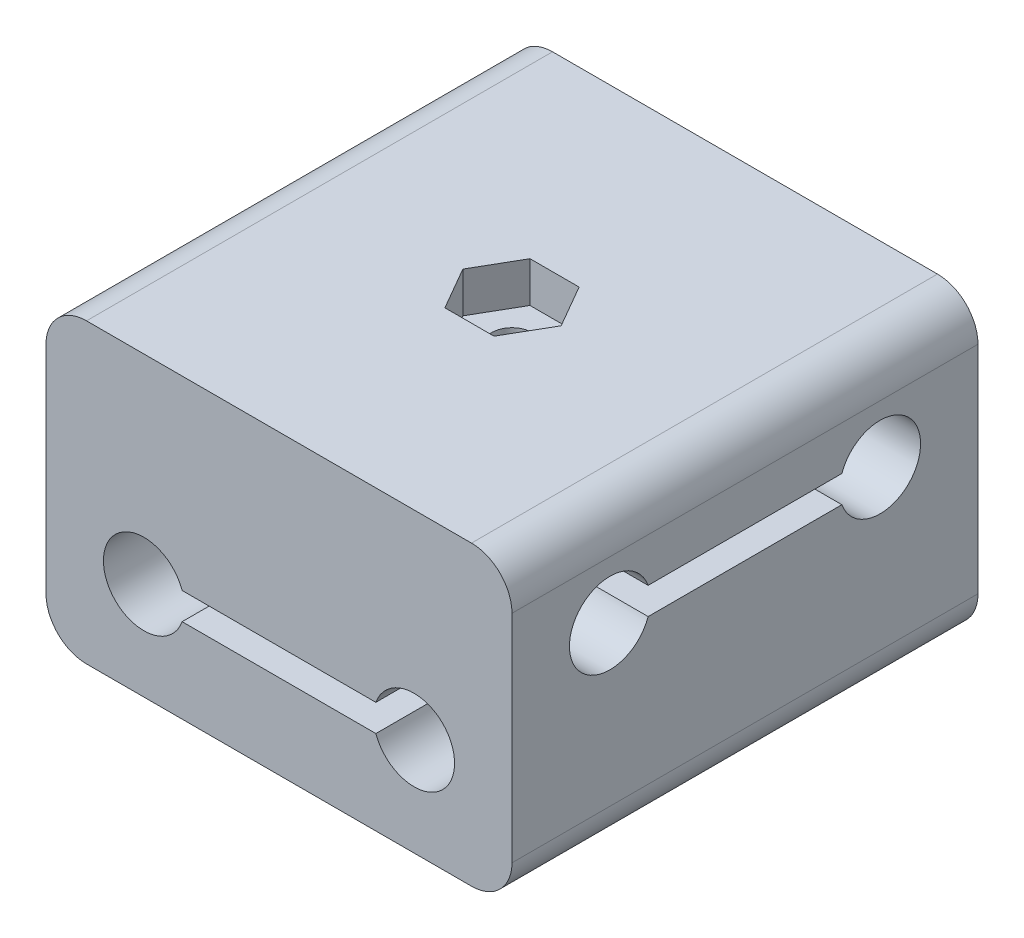
ISO-10303-21;
HEADER;
FILE_DESCRIPTION(('STEP AP214'),'2;1');
FILE_NAME('part.step','',(''),(''),'','','');
FILE_SCHEMA(('AUTOMOTIVE_DESIGN { 1 0 10303 214 1 1 1 1 }'));
ENDSEC;
DATA;
#1=APPLICATION_CONTEXT('core data for automotive mechanical design processes');
#2=APPLICATION_PROTOCOL_DEFINITION('international standard','automotive_design',2000,#1);
#3=PRODUCT_CONTEXT('',#1,'mechanical');
#4=PRODUCT('Part','Part','',(#3));
#5=PRODUCT_RELATED_PRODUCT_CATEGORY('part','',(#4));
#6=PRODUCT_DEFINITION_FORMATION('','',#4);
#7=PRODUCT_DEFINITION_CONTEXT('part definition',#1,'design');
#8=PRODUCT_DEFINITION('design','',#6,#7);
#9=PRODUCT_DEFINITION_SHAPE('','',#8);
#10=(LENGTH_UNIT() NAMED_UNIT(*) SI_UNIT(.MILLI.,.METRE.));
#11=(NAMED_UNIT(*) PLANE_ANGLE_UNIT() SI_UNIT($,.RADIAN.));
#12=(NAMED_UNIT(*) SI_UNIT($,.STERADIAN.) SOLID_ANGLE_UNIT());
#13=UNCERTAINTY_MEASURE_WITH_UNIT(LENGTH_MEASURE(1.E-05),#10,'distance_accuracy_value','');
#14=(GEOMETRIC_REPRESENTATION_CONTEXT(3) GLOBAL_UNCERTAINTY_ASSIGNED_CONTEXT((#13)) GLOBAL_UNIT_ASSIGNED_CONTEXT((#10,
#11,#12)) REPRESENTATION_CONTEXT('',''));
#15=CARTESIAN_POINT('',(0.,0.,0.));
#16=DIRECTION('',(0.,0.,1.));
#17=DIRECTION('',(1.,0.,0.));
#18=AXIS2_PLACEMENT_3D('',#15,#16,#17);
#19=CARTESIAN_POINT('',(17.25,0.,-34.5));
#20=DIRECTION('',(-1.,0.,0.));
#21=DIRECTION('',(0.,0.,1.));
#22=AXIS2_PLACEMENT_3D('',#19,#20,#21);
#23=PLANE('',#22);
#24=CARTESIAN_POINT('',(17.25,3.75,-7.25));
#25=DIRECTION('',(1.,0.,0.));
#26=DIRECTION('',(0.,0.,-1.));
#27=AXIS2_PLACEMENT_3D('',#24,#25,#26);
#28=CIRCLE('',#27,3.);
#29=CARTESIAN_POINT('',(17.25,4.75,-10.0784271247462));
#30=VERTEX_POINT('',#29);
#31=CARTESIAN_POINT('',(17.25,2.75,-10.0784271247462));
#32=VERTEX_POINT('',#31);
#33=EDGE_CURVE('E274',#30,#32,#28,.T.);
#34=ORIENTED_EDGE('',*,*,#33,.F.);
#35=DIRECTION('',(0.,0.,1.));
#36=VECTOR('',#35,1.);
#37=CARTESIAN_POINT('',(17.25,4.75,0.));
#38=LINE('',#37,#36);
#39=CARTESIAN_POINT('',(17.25,4.75,-24.4215728752538));
#40=VERTEX_POINT('',#39);
#41=EDGE_CURVE('E251',#40,#30,#38,.T.);
#42=ORIENTED_EDGE('',*,*,#41,.F.);
#43=CARTESIAN_POINT('',(17.25,3.75,-27.25));
#44=DIRECTION('',(1.,0.,0.));
#45=DIRECTION('',(0.,0.,-1.));
#46=AXIS2_PLACEMENT_3D('',#43,#44,#45);
#47=CIRCLE('',#46,2.99999999999999);
#48=CARTESIAN_POINT('',(17.25,2.75,-24.4215728752538));
#49=VERTEX_POINT('',#48);
#50=EDGE_CURVE('E263',#49,#40,#47,.T.);
#51=ORIENTED_EDGE('',*,*,#50,.F.);
#52=DIRECTION('',(0.,0.,1.));
#53=VECTOR('',#52,1.);
#54=CARTESIAN_POINT('',(17.25,2.75,0.));
#55=LINE('',#54,#53);
#56=EDGE_CURVE('E277',#49,#32,#55,.T.);
#57=ORIENTED_EDGE('',*,*,#56,.T.);
#58=EDGE_LOOP('',(#34,#42,#51,#57));
#59=FACE_BOUND('',#58,.T.);
#60=DIRECTION('',(0.,-1.,0.));
#61=VECTOR('',#60,1.);
#62=CARTESIAN_POINT('',(17.25,0.,0.));
#63=LINE('',#62,#61);
#64=CARTESIAN_POINT('',(17.25,8.,0.));
#65=VERTEX_POINT('',#64);
#66=CARTESIAN_POINT('',(17.25,-8.,0.));
#67=VERTEX_POINT('',#66);
#68=EDGE_CURVE('E322',#65,#67,#63,.T.);
#69=ORIENTED_EDGE('',*,*,#68,.T.);
#70=DIRECTION('',(0.,0.,1.));
#71=VECTOR('',#70,1.);
#72=CARTESIAN_POINT('',(17.25,-8.,-34.5));
#73=LINE('',#72,#71);
#74=CARTESIAN_POINT('',(17.25,-8.,-34.5));
#75=VERTEX_POINT('',#74);
#76=EDGE_CURVE('E379',#67,#75,#73,.F.);
#77=ORIENTED_EDGE('',*,*,#76,.T.);
#78=DIRECTION('',(0.,-1.,0.));
#79=VECTOR('',#78,1.);
#80=CARTESIAN_POINT('',(17.25,0.,-34.5));
#81=LINE('',#80,#79);
#82=CARTESIAN_POINT('',(17.25,8.,-34.5));
#83=VERTEX_POINT('',#82);
#84=EDGE_CURVE('E301',#83,#75,#81,.T.);
#85=ORIENTED_EDGE('',*,*,#84,.F.);
#86=DIRECTION('',(0.,0.,1.));
#87=VECTOR('',#86,1.);
#88=CARTESIAN_POINT('',(17.25,8.,-34.5));
#89=LINE('',#88,#87);
#90=EDGE_CURVE('E376',#83,#65,#89,.T.);
#91=ORIENTED_EDGE('',*,*,#90,.T.);
#92=EDGE_LOOP('',(#69,#77,#85,#91));
#93=FACE_BOUND('',#92,.T.);
#94=ADVANCED_FACE('F48',(#59,#93),#23,.F.);
#95=CARTESIAN_POINT('',(0.,-11.,-34.5));
#96=DIRECTION('',(0.,-1.,0.));
#97=DIRECTION('',(0.,0.,-1.));
#98=AXIS2_PLACEMENT_3D('',#95,#96,#97);
#99=PLANE('',#98);
#100=CARTESIAN_POINT('',(0.,-11.,-17.25));
#101=DIRECTION('',(0.,-1.,0.));
#102=DIRECTION('',(0.,0.,-1.));
#103=AXIS2_PLACEMENT_3D('',#100,#101,#102);
#104=CIRCLE('',#103,3.5);
#105=CARTESIAN_POINT('',(0.,-11.,-20.75));
#106=VERTEX_POINT('',#105);
#107=EDGE_CURVE('E334',#106,#106,#104,.F.);
#108=ORIENTED_EDGE('',*,*,#107,.T.);
#109=EDGE_LOOP('',(#108));
#110=FACE_BOUND('',#109,.T.);
#111=DIRECTION('',(1.,0.,0.));
#112=VECTOR('',#111,1.);
#113=CARTESIAN_POINT('',(0.,-11.,0.));
#114=LINE('',#113,#112);
#115=CARTESIAN_POINT('',(-14.25,-11.,0.));
#116=VERTEX_POINT('',#115);
#117=CARTESIAN_POINT('',(14.25,-11.,0.));
#118=VERTEX_POINT('',#117);
#119=EDGE_CURVE('E294',#116,#118,#114,.T.);
#120=ORIENTED_EDGE('',*,*,#119,.F.);
#121=DIRECTION('',(0.,0.,1.));
#122=VECTOR('',#121,1.);
#123=CARTESIAN_POINT('',(-14.25,-11.,-34.5));
#124=LINE('',#123,#122);
#125=CARTESIAN_POINT('',(-14.25,-11.,-34.5));
#126=VERTEX_POINT('',#125);
#127=EDGE_CURVE('E367',#116,#126,#124,.F.);
#128=ORIENTED_EDGE('',*,*,#127,.T.);
#129=DIRECTION('',(1.,0.,0.));
#130=VECTOR('',#129,1.);
#131=CARTESIAN_POINT('',(0.,-11.,-34.5));
#132=LINE('',#131,#130);
#133=CARTESIAN_POINT('',(14.25,-11.,-34.5));
#134=VERTEX_POINT('',#133);
#135=EDGE_CURVE('E309',#126,#134,#132,.T.);
#136=ORIENTED_EDGE('',*,*,#135,.T.);
#137=DIRECTION('',(0.,0.,1.));
#138=VECTOR('',#137,1.);
#139=CARTESIAN_POINT('',(14.25,-11.,0.));
#140=LINE('',#139,#138);
#141=EDGE_CURVE('E364',#134,#118,#140,.T.);
#142=ORIENTED_EDGE('',*,*,#141,.T.);
#143=EDGE_LOOP('',(#120,#128,#136,#142));
#144=FACE_BOUND('',#143,.T.);
#145=ADVANCED_FACE('F404',(#110,#144),#99,.T.);
#146=CARTESIAN_POINT('',(-17.25,0.,-34.5));
#147=DIRECTION('',(-1.,0.,0.));
#148=DIRECTION('',(0.,-1.,0.));
#149=AXIS2_PLACEMENT_3D('',#146,#147,#148);
#150=PLANE('',#149);
#151=DIRECTION('',(0.,0.,1.));
#152=VECTOR('',#151,1.);
#153=CARTESIAN_POINT('',(-17.25,4.75,0.));
#154=LINE('',#153,#152);
#155=CARTESIAN_POINT('',(-17.25,4.75,-24.4215728752538));
#156=VERTEX_POINT('',#155);
#157=CARTESIAN_POINT('',(-17.25,4.75,-10.0784271247462));
#158=VERTEX_POINT('',#157);
#159=EDGE_CURVE('E259',#156,#158,#154,.T.);
#160=ORIENTED_EDGE('',*,*,#159,.T.);
#161=CARTESIAN_POINT('',(-17.25,3.75,-7.25));
#162=DIRECTION('',(1.,0.,0.));
#163=DIRECTION('',(0.,0.,-1.));
#164=AXIS2_PLACEMENT_3D('',#161,#162,#163);
#165=CIRCLE('',#164,3.);
#166=CARTESIAN_POINT('',(-17.25,2.75,-10.0784271247462));
#167=VERTEX_POINT('',#166);
#168=EDGE_CURVE('E262',#158,#167,#165,.T.);
#169=ORIENTED_EDGE('',*,*,#168,.T.);
#170=DIRECTION('',(0.,0.,1.));
#171=VECTOR('',#170,1.);
#172=CARTESIAN_POINT('',(-17.25,2.75,0.));
#173=LINE('',#172,#171);
#174=CARTESIAN_POINT('',(-17.25,2.75,-24.4215728752538));
#175=VERTEX_POINT('',#174);
#176=EDGE_CURVE('E266',#175,#167,#173,.T.);
#177=ORIENTED_EDGE('',*,*,#176,.F.);
#178=CARTESIAN_POINT('',(-17.25,3.75,-27.25));
#179=DIRECTION('',(1.,0.,0.));
#180=DIRECTION('',(0.,0.,-1.));
#181=AXIS2_PLACEMENT_3D('',#178,#179,#180);
#182=CIRCLE('',#181,2.99999999999999);
#183=EDGE_CURVE('E269',#175,#156,#182,.T.);
#184=ORIENTED_EDGE('',*,*,#183,.T.);
#185=EDGE_LOOP('',(#160,#169,#177,#184));
#186=FACE_BOUND('',#185,.T.);
#187=DIRECTION('',(0.,-1.,0.));
#188=VECTOR('',#187,1.);
#189=CARTESIAN_POINT('',(-17.25,0.,-34.5));
#190=LINE('',#189,#188);
#191=CARTESIAN_POINT('',(-17.25,8.,-34.5));
#192=VERTEX_POINT('',#191);
#193=CARTESIAN_POINT('',(-17.25,-8.,-34.5));
#194=VERTEX_POINT('',#193);
#195=EDGE_CURVE('E306',#192,#194,#190,.T.);
#196=ORIENTED_EDGE('',*,*,#195,.T.);
#197=DIRECTION('',(0.,0.,1.));
#198=VECTOR('',#197,1.);
#199=CARTESIAN_POINT('',(-17.25,-8.,-34.5));
#200=LINE('',#199,#198);
#201=CARTESIAN_POINT('',(-17.25,-8.,0.));
#202=VERTEX_POINT('',#201);
#203=EDGE_CURVE('E353',#194,#202,#200,.T.);
#204=ORIENTED_EDGE('',*,*,#203,.T.);
#205=DIRECTION('',(0.,-1.,0.));
#206=VECTOR('',#205,1.);
#207=CARTESIAN_POINT('',(-17.25,0.,0.));
#208=LINE('',#207,#206);
#209=CARTESIAN_POINT('',(-17.25,8.,0.));
#210=VERTEX_POINT('',#209);
#211=EDGE_CURVE('E327',#210,#202,#208,.T.);
#212=ORIENTED_EDGE('',*,*,#211,.F.);
#213=DIRECTION('',(0.,0.,1.));
#214=VECTOR('',#213,1.);
#215=CARTESIAN_POINT('',(-17.25,8.,-34.5));
#216=LINE('',#215,#214);
#217=EDGE_CURVE('E351',#210,#192,#216,.F.);
#218=ORIENTED_EDGE('',*,*,#217,.T.);
#219=EDGE_LOOP('',(#196,#204,#212,#218));
#220=FACE_BOUND('',#219,.T.);
#221=ADVANCED_FACE('F411',(#186,#220),#150,.T.);
#222=CARTESIAN_POINT('',(10.,-3.75,-34.5));
#223=DIRECTION('',(0.,0.,1.));
#224=DIRECTION('',(1.,0.,0.));
#225=AXIS2_PLACEMENT_3D('',#222,#223,#224);
#226=CYLINDRICAL_SURFACE('',#225,3.);
#227=CARTESIAN_POINT('',(10.,-3.75,0.));
#228=DIRECTION('',(0.,0.,1.));
#229=DIRECTION('',(1.,0.,0.));
#230=AXIS2_PLACEMENT_3D('',#227,#228,#229);
#231=CIRCLE('',#230,3.);
#232=CARTESIAN_POINT('',(7.17157287525381,-4.75,0.));
#233=VERTEX_POINT('',#232);
#234=CARTESIAN_POINT('',(7.17157287525381,-2.75,0.));
#235=VERTEX_POINT('',#234);
#236=EDGE_CURVE('E284',#233,#235,#231,.T.);
#237=ORIENTED_EDGE('',*,*,#236,.T.);
#238=DIRECTION('',(0.,0.,1.));
#239=VECTOR('',#238,1.);
#240=CARTESIAN_POINT('',(7.17157287525381,-2.75,-34.5));
#241=LINE('',#240,#239);
#242=CARTESIAN_POINT('',(7.17157287525381,-2.75,-34.5));
#243=VERTEX_POINT('',#242);
#244=EDGE_CURVE('E332',#243,#235,#241,.T.);
#245=ORIENTED_EDGE('',*,*,#244,.F.);
#246=CARTESIAN_POINT('',(10.,-3.75,-34.5));
#247=DIRECTION('',(0.,0.,1.));
#248=DIRECTION('',(1.,0.,0.));
#249=AXIS2_PLACEMENT_3D('',#246,#247,#248);
#250=CIRCLE('',#249,3.);
#251=CARTESIAN_POINT('',(7.17157287525381,-4.75,-34.5));
#252=VERTEX_POINT('',#251);
#253=EDGE_CURVE('E291',#252,#243,#250,.T.);
#254=ORIENTED_EDGE('',*,*,#253,.F.);
#255=DIRECTION('',(0.,0.,1.));
#256=VECTOR('',#255,1.);
#257=CARTESIAN_POINT('',(7.17157287525381,-4.75,-34.5));
#258=LINE('',#257,#256);
#259=EDGE_CURVE('E312',#252,#233,#258,.T.);
#260=ORIENTED_EDGE('',*,*,#259,.T.);
#261=EDGE_LOOP('',(#237,#245,#254,#260));
#262=FACE_BOUND('',#261,.T.);
#263=ADVANCED_FACE('F433',(#262),#226,.F.);
#264=CARTESIAN_POINT('',(0.,-2.75,-34.5));
#265=DIRECTION('',(0.,-1.,0.));
#266=DIRECTION('',(0.,0.,-1.));
#267=AXIS2_PLACEMENT_3D('',#264,#265,#266);
#268=PLANE('',#267);
#269=CARTESIAN_POINT('',(0.,-2.75,-17.25));
#270=DIRECTION('',(0.,-1.,0.));
#271=DIRECTION('',(0.,0.,-1.));
#272=AXIS2_PLACEMENT_3D('',#269,#270,#271);
#273=CIRCLE('',#272,1.5);
#274=CARTESIAN_POINT('',(0.,-2.75,-18.75));
#275=VERTEX_POINT('',#274);
#276=EDGE_CURVE('E228',#275,#275,#273,.T.);
#277=ORIENTED_EDGE('',*,*,#276,.F.);
#278=EDGE_LOOP('',(#277));
#279=FACE_BOUND('',#278,.T.);
#280=DIRECTION('',(1.,0.,0.));
#281=VECTOR('',#280,1.);
#282=CARTESIAN_POINT('',(0.,-2.75,0.));
#283=LINE('',#282,#281);
#284=CARTESIAN_POINT('',(-7.17157287525381,-2.75,0.));
#285=VERTEX_POINT('',#284);
#286=EDGE_CURVE('E319',#285,#235,#283,.T.);
#287=ORIENTED_EDGE('',*,*,#286,.F.);
#288=DIRECTION('',(0.,0.,1.));
#289=VECTOR('',#288,1.);
#290=CARTESIAN_POINT('',(-7.17157287525381,-2.75,-34.5));
#291=LINE('',#290,#289);
#292=CARTESIAN_POINT('',(-7.17157287525381,-2.75,-34.5));
#293=VERTEX_POINT('',#292);
#294=EDGE_CURVE('E335',#293,#285,#291,.T.);
#295=ORIENTED_EDGE('',*,*,#294,.F.);
#296=DIRECTION('',(1.,0.,0.));
#297=VECTOR('',#296,1.);
#298=CARTESIAN_POINT('',(0.,-2.75,-34.5));
#299=LINE('',#298,#297);
#300=EDGE_CURVE('E298',#293,#243,#299,.T.);
#301=ORIENTED_EDGE('',*,*,#300,.T.);
#302=ORIENTED_EDGE('',*,*,#244,.T.);
#303=EDGE_LOOP('',(#287,#295,#301,#302));
#304=FACE_BOUND('',#303,.T.);
#305=ADVANCED_FACE('F429',(#279,#304),#268,.T.);
#306=CARTESIAN_POINT('',(-10.,-3.75,-34.5));
#307=DIRECTION('',(0.,0.,1.));
#308=DIRECTION('',(1.,0.,0.));
#309=AXIS2_PLACEMENT_3D('',#306,#307,#308);
#310=CYLINDRICAL_SURFACE('',#309,3.);
#311=CARTESIAN_POINT('',(-10.,-3.75,0.));
#312=DIRECTION('',(0.,0.,1.));
#313=DIRECTION('',(1.,0.,0.));
#314=AXIS2_PLACEMENT_3D('',#311,#312,#313);
#315=CIRCLE('',#314,3.);
#316=CARTESIAN_POINT('',(-7.17157287525381,-4.75,0.));
#317=VERTEX_POINT('',#316);
#318=EDGE_CURVE('E317',#285,#317,#315,.T.);
#319=ORIENTED_EDGE('',*,*,#318,.T.);
#320=DIRECTION('',(0.,0.,1.));
#321=VECTOR('',#320,1.);
#322=CARTESIAN_POINT('',(-7.17157287525381,-4.75,-34.5));
#323=LINE('',#322,#321);
#324=CARTESIAN_POINT('',(-7.17157287525381,-4.75,-34.5));
#325=VERTEX_POINT('',#324);
#326=EDGE_CURVE('E337',#325,#317,#323,.T.);
#327=ORIENTED_EDGE('',*,*,#326,.F.);
#328=CARTESIAN_POINT('',(-10.,-3.75,-34.5));
#329=DIRECTION('',(0.,0.,1.));
#330=DIRECTION('',(1.,0.,0.));
#331=AXIS2_PLACEMENT_3D('',#328,#329,#330);
#332=CIRCLE('',#331,3.);
#333=EDGE_CURVE('E296',#293,#325,#332,.T.);
#334=ORIENTED_EDGE('',*,*,#333,.F.);
#335=ORIENTED_EDGE('',*,*,#294,.T.);
#336=EDGE_LOOP('',(#319,#327,#334,#335));
#337=FACE_BOUND('',#336,.T.);
#338=ADVANCED_FACE('F432',(#337),#310,.F.);
#339=CARTESIAN_POINT('',(0.,-4.75,-34.5));
#340=DIRECTION('',(0.,-1.,0.));
#341=DIRECTION('',(0.,0.,-1.));
#342=AXIS2_PLACEMENT_3D('',#339,#340,#341);
#343=PLANE('',#342);
#344=CARTESIAN_POINT('',(0.,-4.75,-17.25));
#345=DIRECTION('',(0.,-1.,0.));
#346=DIRECTION('',(0.,0.,-1.));
#347=AXIS2_PLACEMENT_3D('',#344,#345,#346);
#348=CIRCLE('',#347,1.5);
#349=CARTESIAN_POINT('',(0.,-4.75,-18.75));
#350=VERTEX_POINT('',#349);
#351=EDGE_CURVE('E713',#350,#350,#348,.T.);
#352=ORIENTED_EDGE('',*,*,#351,.T.);
#353=EDGE_LOOP('',(#352));
#354=FACE_BOUND('',#353,.T.);
#355=DIRECTION('',(1.,0.,0.));
#356=VECTOR('',#355,1.);
#357=CARTESIAN_POINT('',(0.,-4.75,0.));
#358=LINE('',#357,#356);
#359=EDGE_CURVE('E315',#317,#233,#358,.T.);
#360=ORIENTED_EDGE('',*,*,#359,.T.);
#361=ORIENTED_EDGE('',*,*,#259,.F.);
#362=DIRECTION('',(1.,0.,0.));
#363=VECTOR('',#362,1.);
#364=CARTESIAN_POINT('',(0.,-4.75,-34.5));
#365=LINE('',#364,#363);
#366=EDGE_CURVE('E293',#325,#252,#365,.T.);
#367=ORIENTED_EDGE('',*,*,#366,.F.);
#368=ORIENTED_EDGE('',*,*,#326,.T.);
#369=EDGE_LOOP('',(#360,#361,#367,#368));
#370=FACE_BOUND('',#369,.T.);
#371=ADVANCED_FACE('F437',(#354,#370),#343,.F.);
#372=CARTESIAN_POINT('',(0.,11.,-34.5));
#373=DIRECTION('',(0.,-1.,0.));
#374=DIRECTION('',(0.,0.,-1.));
#375=AXIS2_PLACEMENT_3D('',#372,#373,#374);
#376=PLANE('',#375);
#377=DIRECTION('',(-1.,0.,0.));
#378=VECTOR('',#377,1.);
#379=CARTESIAN_POINT('',(0.,11.,-20.4));
#380=LINE('',#379,#378);
#381=CARTESIAN_POINT('',(1.81865334794733,11.,-20.4));
#382=VERTEX_POINT('',#381);
#383=CARTESIAN_POINT('',(-1.81865334794732,11.,-20.4));
#384=VERTEX_POINT('',#383);
#385=EDGE_CURVE('E239',#382,#384,#380,.T.);
#386=ORIENTED_EDGE('',*,*,#385,.F.);
#387=DIRECTION('',(-0.5,0.,-0.866025403784439));
#388=VECTOR('',#387,1.);
#389=CARTESIAN_POINT('',(10.1974491295618,11.,-5.88749999999999));
#390=LINE('',#389,#388);
#391=CARTESIAN_POINT('',(3.63730669589465,11.,-17.25));
#392=VERTEX_POINT('',#391);
#393=EDGE_CURVE('E204',#392,#382,#390,.T.);
#394=ORIENTED_EDGE('',*,*,#393,.F.);
#395=DIRECTION('',(0.500000000000001,0.,-0.866025403784438));
#396=VECTOR('',#395,1.);
#397=CARTESIAN_POINT('',(-4.74148908571981,11.,-2.73750000000001));
#398=LINE('',#397,#396);
#399=CARTESIAN_POINT('',(1.81865334794732,11.,-14.1));
#400=VERTEX_POINT('',#399);
#401=EDGE_CURVE('E222',#400,#392,#398,.T.);
#402=ORIENTED_EDGE('',*,*,#401,.F.);
#403=DIRECTION('',(1.,0.,0.));
#404=VECTOR('',#403,1.);
#405=CARTESIAN_POINT('',(0.,11.,-14.1));
#406=LINE('',#405,#404);
#407=CARTESIAN_POINT('',(-1.81865334794732,11.,-14.1));
#408=VERTEX_POINT('',#407);
#409=EDGE_CURVE('E225',#408,#400,#406,.T.);
#410=ORIENTED_EDGE('',*,*,#409,.F.);
#411=DIRECTION('',(0.5,0.,0.866025403784439));
#412=VECTOR('',#411,1.);
#413=CARTESIAN_POINT('',(4.7414890857198,11.,-2.7375));
#414=LINE('',#413,#412);
#415=CARTESIAN_POINT('',(-3.63730669589464,11.,-17.25));
#416=VERTEX_POINT('',#415);
#417=EDGE_CURVE('E244',#416,#408,#414,.T.);
#418=ORIENTED_EDGE('',*,*,#417,.F.);
#419=DIRECTION('',(-0.5,0.,0.866025403784439));
#420=VECTOR('',#419,1.);
#421=CARTESIAN_POINT('',(-10.1974491295618,11.,-5.8875));
#422=LINE('',#421,#420);
#423=EDGE_CURVE('E241',#384,#416,#422,.T.);
#424=ORIENTED_EDGE('',*,*,#423,.F.);
#425=EDGE_LOOP('',(#386,#394,#402,#410,#418,#424));
#426=FACE_BOUND('',#425,.T.);
#427=DIRECTION('',(1.,0.,0.));
#428=VECTOR('',#427,1.);
#429=CARTESIAN_POINT('',(0.,11.,0.));
#430=LINE('',#429,#428);
#431=CARTESIAN_POINT('',(-14.25,11.,0.));
#432=VERTEX_POINT('',#431);
#433=CARTESIAN_POINT('',(14.25,11.,0.));
#434=VERTEX_POINT('',#433);
#435=EDGE_CURVE('E325',#432,#434,#430,.T.);
#436=ORIENTED_EDGE('',*,*,#435,.T.);
#437=DIRECTION('',(0.,0.,1.));
#438=VECTOR('',#437,1.);
#439=CARTESIAN_POINT('',(14.25,11.,-34.5));
#440=LINE('',#439,#438);
#441=CARTESIAN_POINT('',(14.25,11.,-34.5));
#442=VERTEX_POINT('',#441);
#443=EDGE_CURVE('E13',#434,#442,#440,.F.);
#444=ORIENTED_EDGE('',*,*,#443,.T.);
#445=DIRECTION('',(1.,0.,0.));
#446=VECTOR('',#445,1.);
#447=CARTESIAN_POINT('',(0.,11.,-34.5));
#448=LINE('',#447,#446);
#449=CARTESIAN_POINT('',(-14.25,11.,-34.5));
#450=VERTEX_POINT('',#449);
#451=EDGE_CURVE('E304',#450,#442,#448,.T.);
#452=ORIENTED_EDGE('',*,*,#451,.F.);
#453=DIRECTION('',(0.,0.,1.));
#454=VECTOR('',#453,1.);
#455=CARTESIAN_POINT('',(-14.25,11.,0.));
#456=LINE('',#455,#454);
#457=EDGE_CURVE('E56',#450,#432,#456,.T.);
#458=ORIENTED_EDGE('',*,*,#457,.T.);
#459=EDGE_LOOP('',(#436,#444,#452,#458));
#460=FACE_BOUND('',#459,.T.);
#461=ADVANCED_FACE('F383',(#426,#460),#376,.F.);
#462=CARTESIAN_POINT('',(0.,0.,-34.5));
#463=DIRECTION('',(0.,0.,1.));
#464=DIRECTION('',(1.,0.,0.));
#465=AXIS2_PLACEMENT_3D('',#462,#463,#464);
#466=PLANE('',#465);
#467=ORIENTED_EDGE('',*,*,#253,.T.);
#468=ORIENTED_EDGE('',*,*,#300,.F.);
#469=ORIENTED_EDGE('',*,*,#333,.T.);
#470=ORIENTED_EDGE('',*,*,#366,.T.);
#471=EDGE_LOOP('',(#467,#468,#469,#470));
#472=FACE_BOUND('',#471,.T.);
#473=ORIENTED_EDGE('',*,*,#135,.F.);
#474=CARTESIAN_POINT('',(-14.25,-8.,-34.5));
#475=DIRECTION('',(0.,0.,1.));
#476=DIRECTION('',(1.,0.,0.));
#477=AXIS2_PLACEMENT_3D('',#474,#475,#476);
#478=CIRCLE('',#477,3.);
#479=EDGE_CURVE('E374',#126,#194,#478,.F.);
#480=ORIENTED_EDGE('',*,*,#479,.T.);
#481=ORIENTED_EDGE('',*,*,#195,.F.);
#482=CARTESIAN_POINT('',(-14.25,8.,-34.5));
#483=DIRECTION('',(0.,0.,1.));
#484=DIRECTION('',(1.,0.,0.));
#485=AXIS2_PLACEMENT_3D('',#482,#483,#484);
#486=CIRCLE('',#485,3.);
#487=EDGE_CURVE('E68',#192,#450,#486,.F.);
#488=ORIENTED_EDGE('',*,*,#487,.T.);
#489=ORIENTED_EDGE('',*,*,#451,.T.);
#490=CARTESIAN_POINT('',(14.25,8.,-34.5));
#491=DIRECTION('',(0.,0.,1.));
#492=DIRECTION('',(1.,0.,0.));
#493=AXIS2_PLACEMENT_3D('',#490,#491,#492);
#494=CIRCLE('',#493,3.);
#495=EDGE_CURVE('E370',#442,#83,#494,.F.);
#496=ORIENTED_EDGE('',*,*,#495,.T.);
#497=ORIENTED_EDGE('',*,*,#84,.T.);
#498=CARTESIAN_POINT('',(14.25,-8.,-34.5));
#499=DIRECTION('',(0.,0.,1.));
#500=DIRECTION('',(1.,0.,0.));
#501=AXIS2_PLACEMENT_3D('',#498,#499,#500);
#502=CIRCLE('',#501,3.);
#503=EDGE_CURVE('E372',#75,#134,#502,.F.);
#504=ORIENTED_EDGE('',*,*,#503,.T.);
#505=EDGE_LOOP('',(#473,#480,#481,#488,#489,#496,#497,#504));
#506=FACE_BOUND('',#505,.T.);
#507=ADVANCED_FACE('F398',(#472,#506),#466,.F.);
#508=CARTESIAN_POINT('',(0.,0.,0.));
#509=DIRECTION('',(0.,0.,1.));
#510=DIRECTION('',(1.,0.,0.));
#511=AXIS2_PLACEMENT_3D('',#508,#509,#510);
#512=PLANE('',#511);
#513=ORIENTED_EDGE('',*,*,#236,.F.);
#514=ORIENTED_EDGE('',*,*,#359,.F.);
#515=ORIENTED_EDGE('',*,*,#318,.F.);
#516=ORIENTED_EDGE('',*,*,#286,.T.);
#517=EDGE_LOOP('',(#513,#514,#515,#516));
#518=FACE_BOUND('',#517,.T.);
#519=ORIENTED_EDGE('',*,*,#211,.T.);
#520=CARTESIAN_POINT('',(-14.25,-8.,0.));
#521=DIRECTION('',(0.,0.,1.));
#522=DIRECTION('',(1.,0.,0.));
#523=AXIS2_PLACEMENT_3D('',#520,#521,#522);
#524=CIRCLE('',#523,3.);
#525=EDGE_CURVE('E362',#202,#116,#524,.T.);
#526=ORIENTED_EDGE('',*,*,#525,.T.);
#527=ORIENTED_EDGE('',*,*,#119,.T.);
#528=CARTESIAN_POINT('',(14.25,-8.,0.));
#529=DIRECTION('',(0.,0.,1.));
#530=DIRECTION('',(1.,0.,0.));
#531=AXIS2_PLACEMENT_3D('',#528,#529,#530);
#532=CIRCLE('',#531,3.);
#533=EDGE_CURVE('E360',#118,#67,#532,.T.);
#534=ORIENTED_EDGE('',*,*,#533,.T.);
#535=ORIENTED_EDGE('',*,*,#68,.F.);
#536=CARTESIAN_POINT('',(14.25,8.,0.));
#537=DIRECTION('',(0.,0.,1.));
#538=DIRECTION('',(1.,0.,0.));
#539=AXIS2_PLACEMENT_3D('',#536,#537,#538);
#540=CIRCLE('',#539,3.);
#541=EDGE_CURVE('E358',#65,#434,#540,.T.);
#542=ORIENTED_EDGE('',*,*,#541,.T.);
#543=ORIENTED_EDGE('',*,*,#435,.F.);
#544=CARTESIAN_POINT('',(-14.25,8.,0.));
#545=DIRECTION('',(0.,0.,1.));
#546=DIRECTION('',(1.,0.,0.));
#547=AXIS2_PLACEMENT_3D('',#544,#545,#546);
#548=CIRCLE('',#547,3.);
#549=EDGE_CURVE('E356',#432,#210,#548,.T.);
#550=ORIENTED_EDGE('',*,*,#549,.T.);
#551=EDGE_LOOP('',(#519,#526,#527,#534,#535,#542,#543,#550));
#552=FACE_BOUND('',#551,.T.);
#553=ADVANCED_FACE('F386',(#518,#552),#512,.T.);
#554=CARTESIAN_POINT('',(-17.25,4.75,0.));
#555=DIRECTION('',(0.,1.,0.));
#556=DIRECTION('',(0.,0.,1.));
#557=AXIS2_PLACEMENT_3D('',#554,#555,#556);
#558=PLANE('',#557);
#559=CARTESIAN_POINT('',(0.,4.75,-17.25));
#560=DIRECTION('',(0.,1.,0.));
#561=DIRECTION('',(0.,0.,1.));
#562=AXIS2_PLACEMENT_3D('',#559,#560,#561);
#563=CIRCLE('',#562,1.5);
#564=CARTESIAN_POINT('',(0.,4.75,-15.75));
#565=VERTEX_POINT('',#564);
#566=EDGE_CURVE('E711',#565,#565,#563,.T.);
#567=ORIENTED_EDGE('',*,*,#566,.T.);
#568=EDGE_LOOP('',(#567));
#569=FACE_BOUND('',#568,.T.);
#570=ORIENTED_EDGE('',*,*,#41,.T.);
#571=DIRECTION('',(1.,0.,0.));
#572=VECTOR('',#571,1.);
#573=CARTESIAN_POINT('',(-17.25,4.75,-10.0784271247462));
#574=LINE('',#573,#572);
#575=EDGE_CURVE('E272',#158,#30,#574,.T.);
#576=ORIENTED_EDGE('',*,*,#575,.F.);
#577=ORIENTED_EDGE('',*,*,#159,.F.);
#578=DIRECTION('',(1.,0.,0.));
#579=VECTOR('',#578,1.);
#580=CARTESIAN_POINT('',(-17.25,4.75,-24.4215728752538));
#581=LINE('',#580,#579);
#582=EDGE_CURVE('E282',#156,#40,#581,.T.);
#583=ORIENTED_EDGE('',*,*,#582,.T.);
#584=EDGE_LOOP('',(#570,#576,#577,#583));
#585=FACE_BOUND('',#584,.T.);
#586=ADVANCED_FACE('F590',(#569,#585),#558,.F.);
#587=CARTESIAN_POINT('',(-17.25,3.75,-27.25));
#588=DIRECTION('',(1.,0.,0.));
#589=DIRECTION('',(0.,0.,-1.));
#590=AXIS2_PLACEMENT_3D('',#587,#588,#589);
#591=CYLINDRICAL_SURFACE('',#590,2.99999999999999);
#592=ORIENTED_EDGE('',*,*,#50,.T.);
#593=ORIENTED_EDGE('',*,*,#582,.F.);
#594=ORIENTED_EDGE('',*,*,#183,.F.);
#595=DIRECTION('',(1.,0.,0.));
#596=VECTOR('',#595,1.);
#597=CARTESIAN_POINT('',(-17.25,2.75,-24.4215728752538));
#598=LINE('',#597,#596);
#599=EDGE_CURVE('E285',#175,#49,#598,.T.);
#600=ORIENTED_EDGE('',*,*,#599,.T.);
#601=EDGE_LOOP('',(#592,#593,#594,#600));
#602=FACE_BOUND('',#601,.T.);
#603=ADVANCED_FACE('F581',(#602),#591,.F.);
#604=CARTESIAN_POINT('',(-17.25,2.75,0.));
#605=DIRECTION('',(0.,1.,0.));
#606=DIRECTION('',(0.,0.,1.));
#607=AXIS2_PLACEMENT_3D('',#604,#605,#606);
#608=PLANE('',#607);
#609=CARTESIAN_POINT('',(0.,2.75,-17.25));
#610=DIRECTION('',(0.,1.,0.));
#611=DIRECTION('',(0.,0.,1.));
#612=AXIS2_PLACEMENT_3D('',#609,#610,#611);
#613=CIRCLE('',#612,1.5);
#614=CARTESIAN_POINT('',(0.,2.75,-15.75));
#615=VERTEX_POINT('',#614);
#616=EDGE_CURVE('E345',#615,#615,#613,.T.);
#617=ORIENTED_EDGE('',*,*,#616,.F.);
#618=EDGE_LOOP('',(#617));
#619=FACE_BOUND('',#618,.T.);
#620=ORIENTED_EDGE('',*,*,#56,.F.);
#621=ORIENTED_EDGE('',*,*,#599,.F.);
#622=ORIENTED_EDGE('',*,*,#176,.T.);
#623=DIRECTION('',(1.,0.,0.));
#624=VECTOR('',#623,1.);
#625=CARTESIAN_POINT('',(-17.25,2.75,-10.0784271247462));
#626=LINE('',#625,#624);
#627=EDGE_CURVE('E287',#167,#32,#626,.T.);
#628=ORIENTED_EDGE('',*,*,#627,.T.);
#629=EDGE_LOOP('',(#620,#621,#622,#628));
#630=FACE_BOUND('',#629,.T.);
#631=ADVANCED_FACE('F572',(#619,#630),#608,.T.);
#632=CARTESIAN_POINT('',(-17.25,3.75,-7.25));
#633=DIRECTION('',(1.,0.,0.));
#634=DIRECTION('',(0.,0.,-1.));
#635=AXIS2_PLACEMENT_3D('',#632,#633,#634);
#636=CYLINDRICAL_SURFACE('',#635,3.);
#637=ORIENTED_EDGE('',*,*,#33,.T.);
#638=ORIENTED_EDGE('',*,*,#627,.F.);
#639=ORIENTED_EDGE('',*,*,#168,.F.);
#640=ORIENTED_EDGE('',*,*,#575,.T.);
#641=EDGE_LOOP('',(#637,#638,#639,#640));
#642=FACE_BOUND('',#641,.T.);
#643=ADVANCED_FACE('F564',(#642),#636,.F.);
#644=CARTESIAN_POINT('',(10.1974491295618,8.,-5.88749999999999));
#645=DIRECTION('',(0.866025403784439,0.,-0.5));
#646=DIRECTION('',(-0.5,0.,-0.866025403784439));
#647=AXIS2_PLACEMENT_3D('',#644,#645,#646);
#648=PLANE('',#647);
#649=ORIENTED_EDGE('',*,*,#393,.T.);
#650=DIRECTION('',(0.,1.,0.));
#651=VECTOR('',#650,1.);
#652=CARTESIAN_POINT('',(1.81865334794733,8.,-20.4));
#653=LINE('',#652,#651);
#654=CARTESIAN_POINT('',(1.81865334794733,8.,-20.4));
#655=VERTEX_POINT('',#654);
#656=EDGE_CURVE('E197',#655,#382,#653,.T.);
#657=ORIENTED_EDGE('',*,*,#656,.F.);
#658=DIRECTION('',(-0.5,0.,-0.866025403784439));
#659=VECTOR('',#658,1.);
#660=CARTESIAN_POINT('',(10.1974491295618,8.,-5.88749999999999));
#661=LINE('',#660,#659);
#662=CARTESIAN_POINT('',(3.63730669589465,8.,-17.25));
#663=VERTEX_POINT('',#662);
#664=EDGE_CURVE('E201',#663,#655,#661,.T.);
#665=ORIENTED_EDGE('',*,*,#664,.F.);
#666=DIRECTION('',(0.,1.,0.));
#667=VECTOR('',#666,1.);
#668=CARTESIAN_POINT('',(3.63730669589465,8.,-17.25));
#669=LINE('',#668,#667);
#670=EDGE_CURVE('E249',#663,#392,#669,.T.);
#671=ORIENTED_EDGE('',*,*,#670,.T.);
#672=EDGE_LOOP('',(#649,#657,#665,#671));
#673=FACE_BOUND('',#672,.T.);
#674=ADVANCED_FACE('F199',(#673),#648,.F.);
#675=CARTESIAN_POINT('',(-4.74148908571981,8.,-2.73750000000001));
#676=DIRECTION('',(0.866025403784438,0.,0.500000000000001));
#677=DIRECTION('',(0.500000000000001,0.,-0.866025403784438));
#678=AXIS2_PLACEMENT_3D('',#675,#676,#677);
#679=PLANE('',#678);
#680=ORIENTED_EDGE('',*,*,#401,.T.);
#681=ORIENTED_EDGE('',*,*,#670,.F.);
#682=DIRECTION('',(0.500000000000001,0.,-0.866025403784438));
#683=VECTOR('',#682,1.);
#684=CARTESIAN_POINT('',(-4.74148908571981,8.,-2.73750000000001));
#685=LINE('',#684,#683);
#686=CARTESIAN_POINT('',(1.81865334794732,8.,-14.1));
#687=VERTEX_POINT('',#686);
#688=EDGE_CURVE('E209',#687,#663,#685,.T.);
#689=ORIENTED_EDGE('',*,*,#688,.F.);
#690=DIRECTION('',(0.,1.,0.));
#691=VECTOR('',#690,1.);
#692=CARTESIAN_POINT('',(1.81865334794732,8.,-14.1));
#693=LINE('',#692,#691);
#694=EDGE_CURVE('E252',#687,#400,#693,.T.);
#695=ORIENTED_EDGE('',*,*,#694,.T.);
#696=EDGE_LOOP('',(#680,#681,#689,#695));
#697=FACE_BOUND('',#696,.T.);
#698=ADVANCED_FACE('F547',(#697),#679,.F.);
#699=CARTESIAN_POINT('',(0.,8.,-14.1));
#700=DIRECTION('',(0.,0.,1.));
#701=DIRECTION('',(1.,0.,0.));
#702=AXIS2_PLACEMENT_3D('',#699,#700,#701);
#703=PLANE('',#702);
#704=ORIENTED_EDGE('',*,*,#409,.T.);
#705=ORIENTED_EDGE('',*,*,#694,.F.);
#706=DIRECTION('',(1.,0.,0.));
#707=VECTOR('',#706,1.);
#708=CARTESIAN_POINT('',(0.,8.,-14.1));
#709=LINE('',#708,#707);
#710=CARTESIAN_POINT('',(-1.81865334794732,8.,-14.1));
#711=VERTEX_POINT('',#710);
#712=EDGE_CURVE('E235',#711,#687,#709,.T.);
#713=ORIENTED_EDGE('',*,*,#712,.F.);
#714=DIRECTION('',(0.,1.,0.));
#715=VECTOR('',#714,1.);
#716=CARTESIAN_POINT('',(-1.81865334794732,8.,-14.1));
#717=LINE('',#716,#715);
#718=EDGE_CURVE('E254',#711,#408,#717,.T.);
#719=ORIENTED_EDGE('',*,*,#718,.T.);
#720=EDGE_LOOP('',(#704,#705,#713,#719));
#721=FACE_BOUND('',#720,.T.);
#722=ADVANCED_FACE('F538',(#721),#703,.F.);
#723=CARTESIAN_POINT('',(4.7414890857198,8.,-2.7375));
#724=DIRECTION('',(-0.866025403784439,0.,0.5));
#725=DIRECTION('',(0.5,0.,0.866025403784439));
#726=AXIS2_PLACEMENT_3D('',#723,#724,#725);
#727=PLANE('',#726);
#728=ORIENTED_EDGE('',*,*,#417,.T.);
#729=ORIENTED_EDGE('',*,*,#718,.F.);
#730=DIRECTION('',(0.5,0.,0.866025403784439));
#731=VECTOR('',#730,1.);
#732=CARTESIAN_POINT('',(4.7414890857198,8.,-2.7375));
#733=LINE('',#732,#731);
#734=CARTESIAN_POINT('',(-3.63730669589464,8.,-17.25));
#735=VERTEX_POINT('',#734);
#736=EDGE_CURVE('E232',#735,#711,#733,.T.);
#737=ORIENTED_EDGE('',*,*,#736,.F.);
#738=DIRECTION('',(0.,1.,0.));
#739=VECTOR('',#738,1.);
#740=CARTESIAN_POINT('',(-3.63730669589464,8.,-17.25));
#741=LINE('',#740,#739);
#742=EDGE_CURVE('E256',#735,#416,#741,.T.);
#743=ORIENTED_EDGE('',*,*,#742,.T.);
#744=EDGE_LOOP('',(#728,#729,#737,#743));
#745=FACE_BOUND('',#744,.T.);
#746=ADVANCED_FACE('F529',(#745),#727,.F.);
#747=CARTESIAN_POINT('',(-10.1974491295618,8.,-5.8875));
#748=DIRECTION('',(-0.866025403784439,0.,-0.5));
#749=DIRECTION('',(-0.5,0.,0.866025403784439));
#750=AXIS2_PLACEMENT_3D('',#747,#748,#749);
#751=PLANE('',#750);
#752=ORIENTED_EDGE('',*,*,#423,.T.);
#753=ORIENTED_EDGE('',*,*,#742,.F.);
#754=DIRECTION('',(-0.5,0.,0.866025403784439));
#755=VECTOR('',#754,1.);
#756=CARTESIAN_POINT('',(-10.1974491295618,8.,-5.8875));
#757=LINE('',#756,#755);
#758=CARTESIAN_POINT('',(-1.81865334794732,8.,-20.4));
#759=VERTEX_POINT('',#758);
#760=EDGE_CURVE('E217',#759,#735,#757,.T.);
#761=ORIENTED_EDGE('',*,*,#760,.F.);
#762=DIRECTION('',(0.,1.,0.));
#763=VECTOR('',#762,1.);
#764=CARTESIAN_POINT('',(-1.81865334794732,8.,-20.4));
#765=LINE('',#764,#763);
#766=EDGE_CURVE('E208',#759,#384,#765,.T.);
#767=ORIENTED_EDGE('',*,*,#766,.T.);
#768=EDGE_LOOP('',(#752,#753,#761,#767));
#769=FACE_BOUND('',#768,.T.);
#770=ADVANCED_FACE('F520',(#769),#751,.F.);
#771=CARTESIAN_POINT('',(0.,8.,-20.4));
#772=DIRECTION('',(0.,0.,-1.));
#773=DIRECTION('',(-1.,0.,0.));
#774=AXIS2_PLACEMENT_3D('',#771,#772,#773);
#775=PLANE('',#774);
#776=ORIENTED_EDGE('',*,*,#385,.T.);
#777=ORIENTED_EDGE('',*,*,#766,.F.);
#778=DIRECTION('',(-1.,0.,0.));
#779=VECTOR('',#778,1.);
#780=CARTESIAN_POINT('',(0.,8.,-20.4));
#781=LINE('',#780,#779);
#782=EDGE_CURVE('E212',#655,#759,#781,.T.);
#783=ORIENTED_EDGE('',*,*,#782,.F.);
#784=ORIENTED_EDGE('',*,*,#656,.T.);
#785=EDGE_LOOP('',(#776,#777,#783,#784));
#786=FACE_BOUND('',#785,.T.);
#787=ADVANCED_FACE('F213',(#786),#775,.F.);
#788=CARTESIAN_POINT('',(0.,8.,0.));
#789=DIRECTION('',(0.,1.,0.));
#790=DIRECTION('',(0.,0.,1.));
#791=AXIS2_PLACEMENT_3D('',#788,#789,#790);
#792=PLANE('',#791);
#793=CARTESIAN_POINT('',(0.,7.99999999999999,-17.25));
#794=DIRECTION('',(0.,1.,0.));
#795=DIRECTION('',(0.,0.,1.));
#796=AXIS2_PLACEMENT_3D('',#793,#794,#795);
#797=CIRCLE('',#796,1.5);
#798=CARTESIAN_POINT('',(0.,7.99999999999999,-15.75));
#799=VERTEX_POINT('',#798);
#800=EDGE_CURVE('E342',#799,#799,#797,.T.);
#801=ORIENTED_EDGE('',*,*,#800,.F.);
#802=EDGE_LOOP('',(#801));
#803=FACE_BOUND('',#802,.T.);
#804=ORIENTED_EDGE('',*,*,#664,.T.);
#805=ORIENTED_EDGE('',*,*,#782,.T.);
#806=ORIENTED_EDGE('',*,*,#760,.T.);
#807=ORIENTED_EDGE('',*,*,#736,.T.);
#808=ORIENTED_EDGE('',*,*,#712,.T.);
#809=ORIENTED_EDGE('',*,*,#688,.T.);
#810=EDGE_LOOP('',(#804,#805,#806,#807,#808,#809));
#811=FACE_BOUND('',#810,.T.);
#812=ADVANCED_FACE('F219',(#803,#811),#792,.T.);
#813=CARTESIAN_POINT('',(0.,-11.,-17.25));
#814=DIRECTION('',(0.,1.,0.));
#815=DIRECTION('',(0.,0.,1.));
#816=AXIS2_PLACEMENT_3D('',#813,#814,#815);
#817=CYLINDRICAL_SURFACE('',#816,1.5);
#818=ORIENTED_EDGE('',*,*,#800,.T.);
#819=EDGE_LOOP('',(#818));
#820=FACE_BOUND('',#819,.T.);
#821=ORIENTED_EDGE('',*,*,#566,.F.);
#822=EDGE_LOOP('',(#821));
#823=FACE_BOUND('',#822,.T.);
#824=ADVANCED_FACE('F490',(#820,#823),#817,.F.);
#825=ORIENTED_EDGE('',*,*,#276,.T.);
#826=EDGE_LOOP('',(#825));
#827=FACE_BOUND('',#826,.T.);
#828=ORIENTED_EDGE('',*,*,#616,.T.);
#829=EDGE_LOOP('',(#828));
#830=FACE_BOUND('',#829,.T.);
#831=ADVANCED_FACE('F487',(#827,#830),#817,.F.);
#832=CARTESIAN_POINT('',(0.,-8.99999999999999,-17.25));
#833=DIRECTION('',(0.,-1.,0.));
#834=DIRECTION('',(0.,0.,-1.));
#835=AXIS2_PLACEMENT_3D('',#832,#833,#834);
#836=CIRCLE('',#835,1.5);
#837=CARTESIAN_POINT('',(0.,-8.99999999999999,-18.75));
#838=VERTEX_POINT('',#837);
#839=EDGE_CURVE('E348',#838,#838,#836,.T.);
#840=ORIENTED_EDGE('',*,*,#839,.T.);
#841=EDGE_LOOP('',(#840));
#842=FACE_BOUND('',#841,.T.);
#843=ORIENTED_EDGE('',*,*,#351,.F.);
#844=EDGE_LOOP('',(#843));
#845=FACE_BOUND('',#844,.T.);
#846=ADVANCED_FACE('F448',(#842,#845),#817,.F.);
#847=CARTESIAN_POINT('',(0.,-11.,-17.25));
#848=DIRECTION('',(0.,-1.,0.));
#849=DIRECTION('',(0.,0.,-1.));
#850=AXIS2_PLACEMENT_3D('',#847,#848,#849);
#851=CONICAL_SURFACE('',#850,3.5,0.785398163397446);
#852=ORIENTED_EDGE('',*,*,#839,.F.);
#853=EDGE_LOOP('',(#852));
#854=FACE_BOUND('',#853,.T.);
#855=ORIENTED_EDGE('',*,*,#107,.F.);
#856=EDGE_LOOP('',(#855));
#857=FACE_BOUND('',#856,.T.);
#858=ADVANCED_FACE('F445',(#854,#857),#851,.F.);
#859=CARTESIAN_POINT('',(-14.25,-8.,-34.5));
#860=DIRECTION('',(0.,0.,1.));
#861=DIRECTION('',(1.,0.,0.));
#862=AXIS2_PLACEMENT_3D('',#859,#860,#861);
#863=CYLINDRICAL_SURFACE('',#862,3.);
#864=ORIENTED_EDGE('',*,*,#479,.F.);
#865=ORIENTED_EDGE('',*,*,#127,.F.);
#866=ORIENTED_EDGE('',*,*,#525,.F.);
#867=ORIENTED_EDGE('',*,*,#203,.F.);
#868=EDGE_LOOP('',(#864,#865,#866,#867));
#869=FACE_BOUND('',#868,.T.);
#870=ADVANCED_FACE('F409',(#869),#863,.T.);
#871=CARTESIAN_POINT('',(14.25,-8.,-34.5));
#872=DIRECTION('',(0.,0.,-1.));
#873=DIRECTION('',(-1.,0.,0.));
#874=AXIS2_PLACEMENT_3D('',#871,#872,#873);
#875=CYLINDRICAL_SURFACE('',#874,3.);
#876=ORIENTED_EDGE('',*,*,#503,.F.);
#877=ORIENTED_EDGE('',*,*,#76,.F.);
#878=ORIENTED_EDGE('',*,*,#533,.F.);
#879=ORIENTED_EDGE('',*,*,#141,.F.);
#880=EDGE_LOOP('',(#876,#877,#878,#879));
#881=FACE_BOUND('',#880,.T.);
#882=ADVANCED_FACE('F401',(#881),#875,.T.);
#883=CARTESIAN_POINT('',(14.25,8.,-34.5));
#884=DIRECTION('',(0.,0.,1.));
#885=DIRECTION('',(1.,0.,0.));
#886=AXIS2_PLACEMENT_3D('',#883,#884,#885);
#887=CYLINDRICAL_SURFACE('',#886,3.);
#888=ORIENTED_EDGE('',*,*,#495,.F.);
#889=ORIENTED_EDGE('',*,*,#443,.F.);
#890=ORIENTED_EDGE('',*,*,#541,.F.);
#891=ORIENTED_EDGE('',*,*,#90,.F.);
#892=EDGE_LOOP('',(#888,#889,#890,#891));
#893=FACE_BOUND('',#892,.T.);
#894=ADVANCED_FACE('F392',(#893),#887,.T.);
#895=CARTESIAN_POINT('',(-14.25,8.,-34.5));
#896=DIRECTION('',(0.,0.,-1.));
#897=DIRECTION('',(-1.,0.,0.));
#898=AXIS2_PLACEMENT_3D('',#895,#896,#897);
#899=CYLINDRICAL_SURFACE('',#898,3.);
#900=ORIENTED_EDGE('',*,*,#487,.F.);
#901=ORIENTED_EDGE('',*,*,#217,.F.);
#902=ORIENTED_EDGE('',*,*,#549,.F.);
#903=ORIENTED_EDGE('',*,*,#457,.F.);
#904=EDGE_LOOP('',(#900,#901,#902,#903));
#905=FACE_BOUND('',#904,.T.);
#906=ADVANCED_FACE('F50',(#905),#899,.T.);
#907=CLOSED_SHELL('',(#94,#145,#221,#263,#305,#338,#371,#461,#507,#553,#586,#603,#631,#643,#674,
#698,#722,#746,#770,#787,#812,#824,#831,#846,#858,#870,#882,#894,#906));
#908=MANIFOLD_SOLID_BREP('B2',#907);
#909=ADVANCED_BREP_SHAPE_REPRESENTATION('',(#18,#908),#14);
#910=SHAPE_DEFINITION_REPRESENTATION(#9,#909);
ENDSEC;
END-ISO-10303-21;
